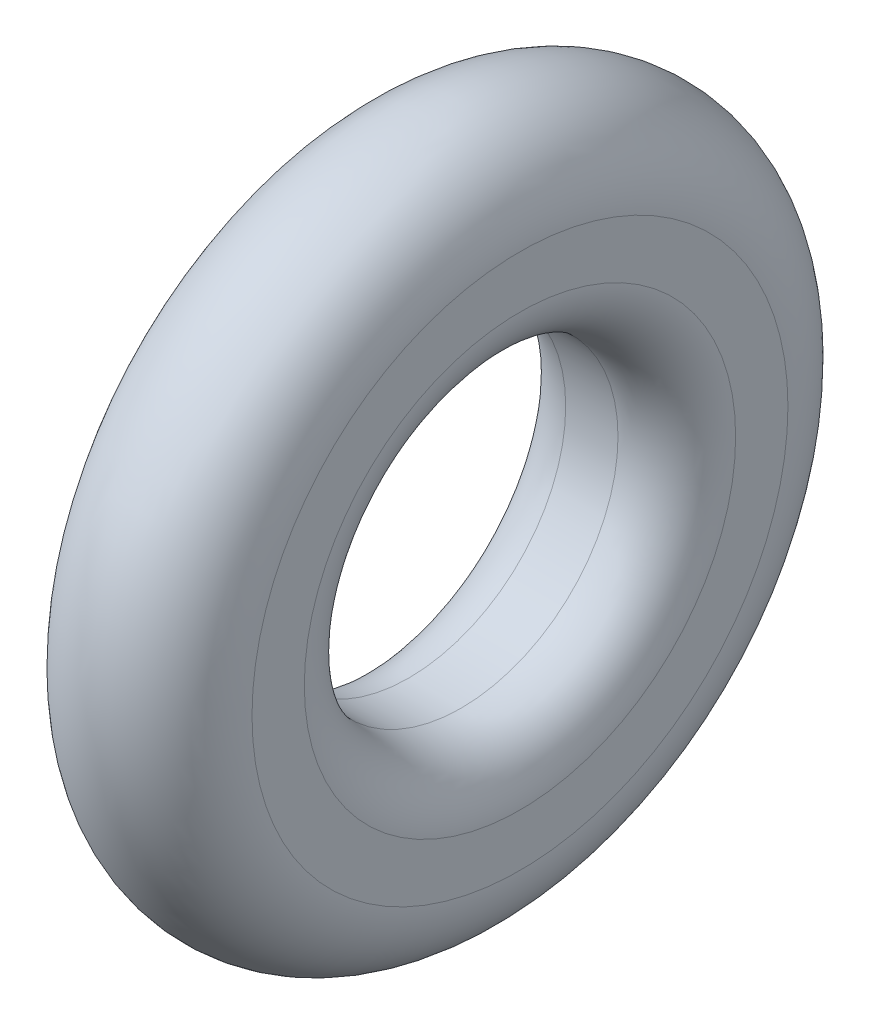
ISO-10303-21;
HEADER;
FILE_DESCRIPTION(('STEP AP214'),'2;1');
FILE_NAME('part.step','',(''),(''),'','','');
FILE_SCHEMA(('AUTOMOTIVE_DESIGN { 1 0 10303 214 1 1 1 1 }'));
ENDSEC;
DATA;
#1=APPLICATION_CONTEXT('core data for automotive mechanical design processes');
#2=APPLICATION_PROTOCOL_DEFINITION('international standard','automotive_design',2000,#1);
#3=PRODUCT_CONTEXT('',#1,'mechanical');
#4=PRODUCT('Part','Part','',(#3));
#5=PRODUCT_RELATED_PRODUCT_CATEGORY('part','',(#4));
#6=PRODUCT_DEFINITION_FORMATION('','',#4);
#7=PRODUCT_DEFINITION_CONTEXT('part definition',#1,'design');
#8=PRODUCT_DEFINITION('design','',#6,#7);
#9=PRODUCT_DEFINITION_SHAPE('','',#8);
#10=(LENGTH_UNIT() NAMED_UNIT(*) SI_UNIT(.MILLI.,.METRE.));
#11=(NAMED_UNIT(*) PLANE_ANGLE_UNIT() SI_UNIT($,.RADIAN.));
#12=(NAMED_UNIT(*) SI_UNIT($,.STERADIAN.) SOLID_ANGLE_UNIT());
#13=UNCERTAINTY_MEASURE_WITH_UNIT(LENGTH_MEASURE(1.E-05),#10,'distance_accuracy_value','');
#14=(GEOMETRIC_REPRESENTATION_CONTEXT(3) GLOBAL_UNCERTAINTY_ASSIGNED_CONTEXT((#13)) GLOBAL_UNIT_ASSIGNED_CONTEXT((#10,
#11,#12)) REPRESENTATION_CONTEXT('',''));
#15=CARTESIAN_POINT('',(0.,0.,0.));
#16=DIRECTION('',(0.,0.,1.));
#17=DIRECTION('',(1.,0.,0.));
#18=AXIS2_PLACEMENT_3D('',#15,#16,#17);
#19=CARTESIAN_POINT('',(-0.5,0.,0.));
#20=DIRECTION('',(1.,0.,0.));
#21=DIRECTION('',(0.,0.,-1.));
#22=AXIS2_PLACEMENT_3D('',#19,#20,#21);
#23=TOROIDAL_SURFACE('',#22,4.125,1.125);
#24=CARTESIAN_POINT('',(-0.5,0.,0.));
#25=DIRECTION('',(1.,0.,0.));
#26=DIRECTION('',(0.,0.,-1.));
#27=AXIS2_PLACEMENT_3D('',#24,#25,#26);
#28=CIRCLE('',#27,3.);
#29=CARTESIAN_POINT('',(-0.5,0.,-3.));
#30=VERTEX_POINT('',#29);
#31=EDGE_CURVE('E53',#30,#30,#28,.T.);
#32=ORIENTED_EDGE('',*,*,#31,.T.);
#33=EDGE_LOOP('',(#32));
#34=FACE_BOUND('',#33,.T.);
#35=CARTESIAN_POINT('',(-1.625,0.,0.));
#36=DIRECTION('',(1.,0.,0.));
#37=DIRECTION('',(0.,0.,-1.));
#38=AXIS2_PLACEMENT_3D('',#35,#36,#37);
#39=CIRCLE('',#38,4.125);
#40=CARTESIAN_POINT('',(-1.625,0.,-4.125));
#41=VERTEX_POINT('',#40);
#42=EDGE_CURVE('E10',#41,#41,#39,.T.);
#43=ORIENTED_EDGE('',*,*,#42,.F.);
#44=EDGE_LOOP('',(#43));
#45=FACE_BOUND('',#44,.T.);
#46=ADVANCED_FACE('F31',(#34,#45),#23,.T.);
#47=CARTESIAN_POINT('',(-1.625,4.125,0.));
#48=DIRECTION('',(-1.,0.,0.));
#49=DIRECTION('',(0.,0.,1.));
#50=AXIS2_PLACEMENT_3D('',#47,#48,#49);
#51=PLANE('',#50);
#52=ORIENTED_EDGE('',*,*,#42,.T.);
#53=EDGE_LOOP('',(#52));
#54=FACE_BOUND('',#53,.T.);
#55=CARTESIAN_POINT('',(-1.625,0.,0.));
#56=DIRECTION('',(1.,0.,0.));
#57=DIRECTION('',(0.,0.,-1.));
#58=AXIS2_PLACEMENT_3D('',#55,#56,#57);
#59=CIRCLE('',#58,5.125);
#60=CARTESIAN_POINT('',(-1.625,0.,-5.125));
#61=VERTEX_POINT('',#60);
#62=EDGE_CURVE('E37',#61,#61,#59,.T.);
#63=ORIENTED_EDGE('',*,*,#62,.F.);
#64=EDGE_LOOP('',(#63));
#65=FACE_BOUND('',#64,.T.);
#66=ADVANCED_FACE('F71',(#54,#65),#51,.T.);
#67=CARTESIAN_POINT('',(0.,0.,0.));
#68=DIRECTION('',(1.,0.,0.));
#69=DIRECTION('',(0.,0.,-1.));
#70=AXIS2_PLACEMENT_3D('',#67,#68,#69);
#71=TOROIDAL_SURFACE('',#70,5.125,1.625);
#72=ORIENTED_EDGE('',*,*,#62,.T.);
#73=EDGE_LOOP('',(#72));
#74=FACE_BOUND('',#73,.T.);
#75=CARTESIAN_POINT('',(1.625,0.,0.));
#76=DIRECTION('',(1.,0.,0.));
#77=DIRECTION('',(0.,0.,-1.));
#78=AXIS2_PLACEMENT_3D('',#75,#76,#77);
#79=CIRCLE('',#78,5.125);
#80=CARTESIAN_POINT('',(1.625,0.,-5.125));
#81=VERTEX_POINT('',#80);
#82=EDGE_CURVE('E41',#81,#81,#79,.T.);
#83=ORIENTED_EDGE('',*,*,#82,.F.);
#84=EDGE_LOOP('',(#83));
#85=FACE_BOUND('',#84,.T.);
#86=ADVANCED_FACE('F75',(#74,#85),#71,.T.);
#87=CARTESIAN_POINT('',(1.625,4.125,0.));
#88=DIRECTION('',(1.,0.,0.));
#89=DIRECTION('',(0.,0.,-1.));
#90=AXIS2_PLACEMENT_3D('',#87,#88,#89);
#91=PLANE('',#90);
#92=ORIENTED_EDGE('',*,*,#82,.T.);
#93=EDGE_LOOP('',(#92));
#94=FACE_BOUND('',#93,.T.);
#95=CARTESIAN_POINT('',(1.625,0.,0.));
#96=DIRECTION('',(1.,0.,0.));
#97=DIRECTION('',(0.,0.,-1.));
#98=AXIS2_PLACEMENT_3D('',#95,#96,#97);
#99=CIRCLE('',#98,4.125);
#100=CARTESIAN_POINT('',(1.625,0.,-4.125));
#101=VERTEX_POINT('',#100);
#102=EDGE_CURVE('E45',#101,#101,#99,.T.);
#103=ORIENTED_EDGE('',*,*,#102,.F.);
#104=EDGE_LOOP('',(#103));
#105=FACE_BOUND('',#104,.T.);
#106=ADVANCED_FACE('F67',(#94,#105),#91,.T.);
#107=CARTESIAN_POINT('',(0.5,0.,0.));
#108=DIRECTION('',(1.,0.,0.));
#109=DIRECTION('',(0.,0.,-1.));
#110=AXIS2_PLACEMENT_3D('',#107,#108,#109);
#111=TOROIDAL_SURFACE('',#110,4.125,1.125);
#112=ORIENTED_EDGE('',*,*,#102,.T.);
#113=EDGE_LOOP('',(#112));
#114=FACE_BOUND('',#113,.T.);
#115=CARTESIAN_POINT('',(0.5,0.,0.));
#116=DIRECTION('',(1.,0.,0.));
#117=DIRECTION('',(0.,0.,-1.));
#118=AXIS2_PLACEMENT_3D('',#115,#116,#117);
#119=CIRCLE('',#118,3.);
#120=CARTESIAN_POINT('',(0.5,0.,-3.));
#121=VERTEX_POINT('',#120);
#122=EDGE_CURVE('E50',#121,#121,#119,.T.);
#123=ORIENTED_EDGE('',*,*,#122,.F.);
#124=EDGE_LOOP('',(#123));
#125=FACE_BOUND('',#124,.T.);
#126=ADVANCED_FACE('F61',(#114,#125),#111,.T.);
#127=CARTESIAN_POINT('',(0.,0.,0.));
#128=DIRECTION('',(1.,0.,0.));
#129=DIRECTION('',(0.,0.,-1.));
#130=AXIS2_PLACEMENT_3D('',#127,#128,#129);
#131=CYLINDRICAL_SURFACE('',#130,3.);
#132=ORIENTED_EDGE('',*,*,#122,.T.);
#133=EDGE_LOOP('',(#132));
#134=FACE_BOUND('',#133,.T.);
#135=ORIENTED_EDGE('',*,*,#31,.F.);
#136=EDGE_LOOP('',(#135));
#137=FACE_BOUND('',#136,.T.);
#138=ADVANCED_FACE('F59',(#134,#137),#131,.F.);
#139=CLOSED_SHELL('',(#46,#66,#86,#106,#126,#138));
#140=MANIFOLD_SOLID_BREP('B2',#139);
#141=ADVANCED_BREP_SHAPE_REPRESENTATION('',(#18,#140),#14);
#142=SHAPE_DEFINITION_REPRESENTATION(#9,#141);
ENDSEC;
END-ISO-10303-21;
